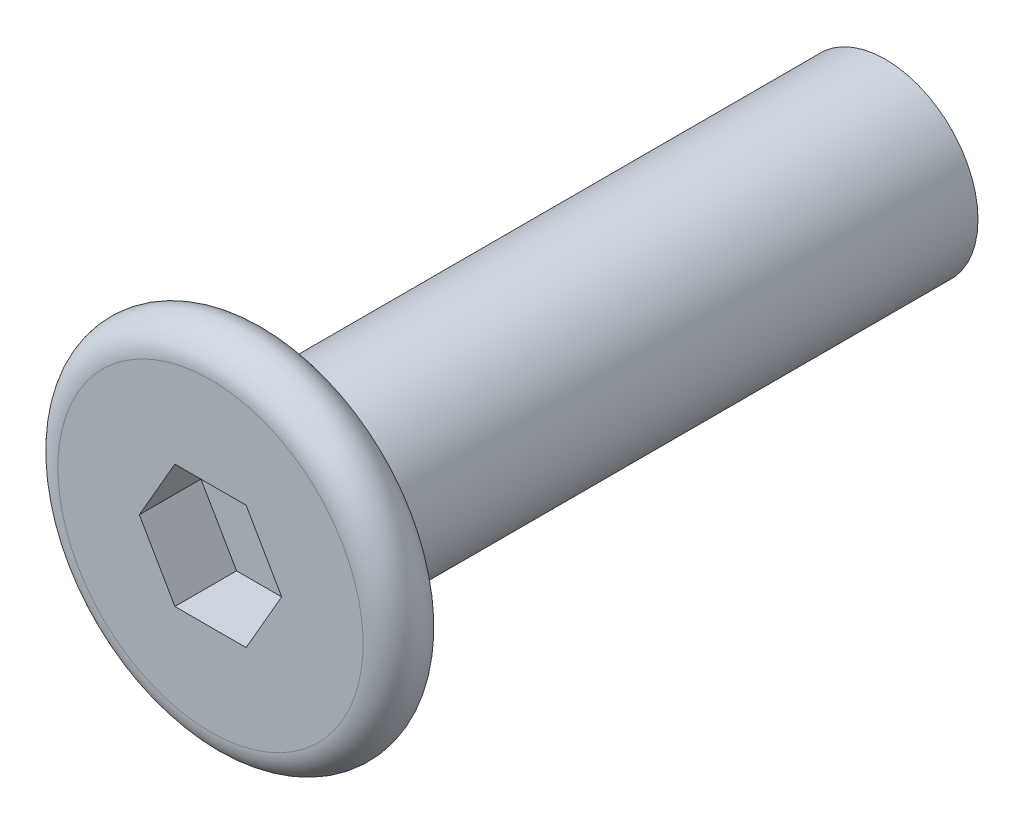
ISO-10303-21;
HEADER;
FILE_DESCRIPTION(('STEP AP214'),'2;1');
FILE_NAME('part.step','',(''),(''),'','','');
FILE_SCHEMA(('AUTOMOTIVE_DESIGN { 1 0 10303 214 1 1 1 1 }'));
ENDSEC;
DATA;
#1=APPLICATION_CONTEXT('core data for automotive mechanical design processes');
#2=APPLICATION_PROTOCOL_DEFINITION('international standard','automotive_design',2000,#1);
#3=PRODUCT_CONTEXT('',#1,'mechanical');
#4=PRODUCT('Part','Part','',(#3));
#5=PRODUCT_RELATED_PRODUCT_CATEGORY('part','',(#4));
#6=PRODUCT_DEFINITION_FORMATION('','',#4);
#7=PRODUCT_DEFINITION_CONTEXT('part definition',#1,'design');
#8=PRODUCT_DEFINITION('design','',#6,#7);
#9=PRODUCT_DEFINITION_SHAPE('','',#8);
#10=(LENGTH_UNIT() NAMED_UNIT(*) SI_UNIT(.MILLI.,.METRE.));
#11=(NAMED_UNIT(*) PLANE_ANGLE_UNIT() SI_UNIT($,.RADIAN.));
#12=(NAMED_UNIT(*) SI_UNIT($,.STERADIAN.) SOLID_ANGLE_UNIT());
#13=UNCERTAINTY_MEASURE_WITH_UNIT(LENGTH_MEASURE(1.E-05),#10,'distance_accuracy_value','');
#14=(GEOMETRIC_REPRESENTATION_CONTEXT(3) GLOBAL_UNCERTAINTY_ASSIGNED_CONTEXT((#13)) GLOBAL_UNIT_ASSIGNED_CONTEXT((#10,
#11,#12)) REPRESENTATION_CONTEXT('',''));
#15=CARTESIAN_POINT('',(0.,0.,0.));
#16=DIRECTION('',(0.,0.,1.));
#17=DIRECTION('',(1.,0.,0.));
#18=AXIS2_PLACEMENT_3D('',#15,#16,#17);
#19=CARTESIAN_POINT('',(0.,0.,-0.475));
#20=DIRECTION('',(0.,0.,-1.));
#21=DIRECTION('',(0.,1.,0.));
#22=AXIS2_PLACEMENT_3D('',#19,#20,#21);
#23=TOROIDAL_SURFACE('',#22,2.475,0.475);
#24=CARTESIAN_POINT('',(0.,0.,0.));
#25=DIRECTION('',(0.,0.,1.));
#26=DIRECTION('',(0.,-1.,0.));
#27=AXIS2_PLACEMENT_3D('',#24,#25,#26);
#28=CIRCLE('',#27,2.475);
#29=CARTESIAN_POINT('',(0.,-2.475,0.));
#30=VERTEX_POINT('',#29);
#31=EDGE_CURVE('E49',#30,#30,#28,.T.);
#32=ORIENTED_EDGE('',*,*,#31,.F.);
#33=EDGE_LOOP('',(#32));
#34=FACE_BOUND('',#33,.T.);
#35=CARTESIAN_POINT('',(0.,0.,-0.95));
#36=DIRECTION('',(0.,0.,-1.));
#37=DIRECTION('',(0.,1.,0.));
#38=AXIS2_PLACEMENT_3D('',#35,#36,#37);
#39=CIRCLE('',#38,2.475);
#40=CARTESIAN_POINT('',(0.,2.475,-0.95));
#41=VERTEX_POINT('',#40);
#42=EDGE_CURVE('E11',#41,#41,#39,.T.);
#43=ORIENTED_EDGE('',*,*,#42,.F.);
#44=EDGE_LOOP('',(#43));
#45=FACE_BOUND('',#44,.T.);
#46=ADVANCED_FACE('F41',(#34,#45),#23,.T.);
#47=CARTESIAN_POINT('',(0.,0.,0.));
#48=DIRECTION('',(0.,0.,1.));
#49=DIRECTION('',(0.,-1.,0.));
#50=AXIS2_PLACEMENT_3D('',#47,#48,#49);
#51=PLANE('',#50);
#52=DIRECTION('',(-0.5,0.866025403784439,0.));
#53=VECTOR('',#52,1.);
#54=CARTESIAN_POINT('',(1.15470053837925,0.,0.));
#55=LINE('',#54,#53);
#56=CARTESIAN_POINT('',(1.15470053837925,0.,0.));
#57=VERTEX_POINT('',#56);
#58=CARTESIAN_POINT('',(0.577350269189626,1.,0.));
#59=VERTEX_POINT('',#58);
#60=EDGE_CURVE('E56',#57,#59,#55,.T.);
#61=ORIENTED_EDGE('',*,*,#60,.F.);
#62=DIRECTION('',(0.5,0.866025403784439,0.));
#63=VECTOR('',#62,1.);
#64=CARTESIAN_POINT('',(0.577350269189626,-1.,0.));
#65=LINE('',#64,#63);
#66=CARTESIAN_POINT('',(0.577350269189626,-1.,0.));
#67=VERTEX_POINT('',#66);
#68=EDGE_CURVE('E139',#67,#57,#65,.T.);
#69=ORIENTED_EDGE('',*,*,#68,.F.);
#70=DIRECTION('',(1.,0.,0.));
#71=VECTOR('',#70,1.);
#72=CARTESIAN_POINT('',(-0.577350269189626,-1.,0.));
#73=LINE('',#72,#71);
#74=CARTESIAN_POINT('',(-0.577350269189626,-1.,0.));
#75=VERTEX_POINT('',#74);
#76=EDGE_CURVE('E137',#75,#67,#73,.T.);
#77=ORIENTED_EDGE('',*,*,#76,.F.);
#78=DIRECTION('',(0.5,-0.866025403784439,0.));
#79=VECTOR('',#78,1.);
#80=CARTESIAN_POINT('',(-1.15470053837925,0.,0.));
#81=LINE('',#80,#79);
#82=CARTESIAN_POINT('',(-1.15470053837925,0.,0.));
#83=VERTEX_POINT('',#82);
#84=EDGE_CURVE('E104',#83,#75,#81,.T.);
#85=ORIENTED_EDGE('',*,*,#84,.F.);
#86=DIRECTION('',(-0.5,-0.866025403784439,0.));
#87=VECTOR('',#86,1.);
#88=CARTESIAN_POINT('',(-0.577350269189626,1.,0.));
#89=LINE('',#88,#87);
#90=CARTESIAN_POINT('',(-0.577350269189626,1.,0.));
#91=VERTEX_POINT('',#90);
#92=EDGE_CURVE('E133',#91,#83,#89,.T.);
#93=ORIENTED_EDGE('',*,*,#92,.F.);
#94=DIRECTION('',(-1.,0.,0.));
#95=VECTOR('',#94,1.);
#96=CARTESIAN_POINT('',(0.577350269189626,1.,0.));
#97=LINE('',#96,#95);
#98=EDGE_CURVE('E130',#59,#91,#97,.T.);
#99=ORIENTED_EDGE('',*,*,#98,.F.);
#100=EDGE_LOOP('',(#61,#69,#77,#85,#93,#99));
#101=FACE_BOUND('',#100,.T.);
#102=ORIENTED_EDGE('',*,*,#31,.T.);
#103=EDGE_LOOP('',(#102));
#104=FACE_BOUND('',#103,.T.);
#105=ADVANCED_FACE('F156',(#101,#104),#51,.T.);
#106=CARTESIAN_POINT('',(0.,2.95,-0.95));
#107=DIRECTION('',(0.,0.,-1.));
#108=DIRECTION('',(0.,1.,0.));
#109=AXIS2_PLACEMENT_3D('',#106,#107,#108);
#110=PLANE('',#109);
#111=ORIENTED_EDGE('',*,*,#42,.T.);
#112=EDGE_LOOP('',(#111));
#113=FACE_BOUND('',#112,.T.);
#114=CARTESIAN_POINT('',(0.,0.,-0.950000000000001));
#115=DIRECTION('',(0.,0.,-1.));
#116=DIRECTION('',(0.,1.,0.));
#117=AXIS2_PLACEMENT_3D('',#114,#115,#116);
#118=CIRCLE('',#117,1.5);
#119=CARTESIAN_POINT('',(0.,1.5,-0.950000000000001));
#120=VERTEX_POINT('',#119);
#121=EDGE_CURVE('E151',#120,#120,#118,.T.);
#122=ORIENTED_EDGE('',*,*,#121,.F.);
#123=EDGE_LOOP('',(#122));
#124=FACE_BOUND('',#123,.T.);
#125=ADVANCED_FACE('F162',(#113,#124),#110,.T.);
#126=CARTESIAN_POINT('',(0.,0.,-10.95));
#127=DIRECTION('',(0.,0.,-1.));
#128=DIRECTION('',(0.,1.,0.));
#129=AXIS2_PLACEMENT_3D('',#126,#127,#128);
#130=CYLINDRICAL_SURFACE('',#129,1.5);
#131=ORIENTED_EDGE('',*,*,#121,.T.);
#132=EDGE_LOOP('',(#131));
#133=FACE_BOUND('',#132,.T.);
#134=CARTESIAN_POINT('',(0.,0.,-10.95));
#135=DIRECTION('',(0.,0.,-1.));
#136=DIRECTION('',(0.,1.,0.));
#137=AXIS2_PLACEMENT_3D('',#134,#135,#136);
#138=CIRCLE('',#137,1.5);
#139=CARTESIAN_POINT('',(0.,1.5,-10.95));
#140=VERTEX_POINT('',#139);
#141=EDGE_CURVE('E143',#140,#140,#138,.T.);
#142=ORIENTED_EDGE('',*,*,#141,.F.);
#143=EDGE_LOOP('',(#142));
#144=FACE_BOUND('',#143,.T.);
#145=ADVANCED_FACE('F165',(#133,#144),#130,.T.);
#146=CARTESIAN_POINT('',(0.,1.5,-10.95));
#147=DIRECTION('',(0.,0.,-1.));
#148=DIRECTION('',(0.,1.,0.));
#149=AXIS2_PLACEMENT_3D('',#146,#147,#148);
#150=PLANE('',#149);
#151=ORIENTED_EDGE('',*,*,#141,.T.);
#152=EDGE_LOOP('',(#151));
#153=FACE_BOUND('',#152,.T.);
#154=ADVANCED_FACE('F171',(#153),#150,.T.);
#155=CARTESIAN_POINT('',(1.15470053837925,0.,-1.));
#156=DIRECTION('',(0.866025403784439,0.5,0.));
#157=DIRECTION('',(-0.5,0.866025403784439,0.));
#158=AXIS2_PLACEMENT_3D('',#155,#156,#157);
#159=PLANE('',#158);
#160=ORIENTED_EDGE('',*,*,#60,.T.);
#161=DIRECTION('',(0.,0.,1.));
#162=VECTOR('',#161,1.);
#163=CARTESIAN_POINT('',(0.577350269189626,1.,-1.));
#164=LINE('',#163,#162);
#165=CARTESIAN_POINT('',(0.577350269189626,1.,-1.));
#166=VERTEX_POINT('',#165);
#167=EDGE_CURVE('E86',#166,#59,#164,.T.);
#168=ORIENTED_EDGE('',*,*,#167,.F.);
#169=DIRECTION('',(-0.5,0.866025403784439,0.));
#170=VECTOR('',#169,1.);
#171=CARTESIAN_POINT('',(1.15470053837925,0.,-1.));
#172=LINE('',#171,#170);
#173=CARTESIAN_POINT('',(1.15470053837925,0.,-1.));
#174=VERTEX_POINT('',#173);
#175=EDGE_CURVE('E141',#174,#166,#172,.T.);
#176=ORIENTED_EDGE('',*,*,#175,.F.);
#177=DIRECTION('',(0.,0.,1.));
#178=VECTOR('',#177,1.);
#179=CARTESIAN_POINT('',(1.15470053837925,0.,-1.));
#180=LINE('',#179,#178);
#181=EDGE_CURVE('E64',#174,#57,#180,.T.);
#182=ORIENTED_EDGE('',*,*,#181,.T.);
#183=EDGE_LOOP('',(#160,#168,#176,#182));
#184=FACE_BOUND('',#183,.T.);
#185=ADVANCED_FACE('F176',(#184),#159,.F.);
#186=CARTESIAN_POINT('',(0.577350269189626,-1.,-1.));
#187=DIRECTION('',(0.866025403784439,-0.5,0.));
#188=DIRECTION('',(0.5,0.866025403784439,0.));
#189=AXIS2_PLACEMENT_3D('',#186,#187,#188);
#190=PLANE('',#189);
#191=ORIENTED_EDGE('',*,*,#68,.T.);
#192=ORIENTED_EDGE('',*,*,#181,.F.);
#193=DIRECTION('',(0.5,0.866025403784439,0.));
#194=VECTOR('',#193,1.);
#195=CARTESIAN_POINT('',(0.577350269189626,-1.,-1.));
#196=LINE('',#195,#194);
#197=CARTESIAN_POINT('',(0.577350269189626,-1.,-1.));
#198=VERTEX_POINT('',#197);
#199=EDGE_CURVE('E116',#198,#174,#196,.T.);
#200=ORIENTED_EDGE('',*,*,#199,.F.);
#201=DIRECTION('',(0.,0.,1.));
#202=VECTOR('',#201,1.);
#203=CARTESIAN_POINT('',(0.577350269189626,-1.,-1.));
#204=LINE('',#203,#202);
#205=EDGE_CURVE('E108',#198,#67,#204,.T.);
#206=ORIENTED_EDGE('',*,*,#205,.T.);
#207=EDGE_LOOP('',(#191,#192,#200,#206));
#208=FACE_BOUND('',#207,.T.);
#209=ADVANCED_FACE('F181',(#208),#190,.F.);
#210=CARTESIAN_POINT('',(-0.577350269189626,-1.,-1.));
#211=DIRECTION('',(0.,-1.,0.));
#212=DIRECTION('',(0.,0.,-1.));
#213=AXIS2_PLACEMENT_3D('',#210,#211,#212);
#214=PLANE('',#213);
#215=ORIENTED_EDGE('',*,*,#76,.T.);
#216=ORIENTED_EDGE('',*,*,#205,.F.);
#217=DIRECTION('',(1.,0.,0.));
#218=VECTOR('',#217,1.);
#219=CARTESIAN_POINT('',(-0.577350269189626,-1.,-1.));
#220=LINE('',#219,#218);
#221=CARTESIAN_POINT('',(-0.577350269189626,-1.,-1.));
#222=VERTEX_POINT('',#221);
#223=EDGE_CURVE('E112',#222,#198,#220,.T.);
#224=ORIENTED_EDGE('',*,*,#223,.F.);
#225=DIRECTION('',(0.,0.,1.));
#226=VECTOR('',#225,1.);
#227=CARTESIAN_POINT('',(-0.577350269189626,-1.,-1.));
#228=LINE('',#227,#226);
#229=EDGE_CURVE('E97',#222,#75,#228,.T.);
#230=ORIENTED_EDGE('',*,*,#229,.T.);
#231=EDGE_LOOP('',(#215,#216,#224,#230));
#232=FACE_BOUND('',#231,.T.);
#233=ADVANCED_FACE('F113',(#232),#214,.F.);
#234=CARTESIAN_POINT('',(-1.15470053837925,0.,-1.));
#235=DIRECTION('',(-0.866025403784439,-0.5,0.));
#236=DIRECTION('',(0.5,-0.866025403784439,0.));
#237=AXIS2_PLACEMENT_3D('',#234,#235,#236);
#238=PLANE('',#237);
#239=ORIENTED_EDGE('',*,*,#84,.T.);
#240=ORIENTED_EDGE('',*,*,#229,.F.);
#241=DIRECTION('',(0.5,-0.866025403784439,0.));
#242=VECTOR('',#241,1.);
#243=CARTESIAN_POINT('',(-1.15470053837925,0.,-1.));
#244=LINE('',#243,#242);
#245=CARTESIAN_POINT('',(-1.15470053837925,0.,-1.));
#246=VERTEX_POINT('',#245);
#247=EDGE_CURVE('E101',#246,#222,#244,.T.);
#248=ORIENTED_EDGE('',*,*,#247,.F.);
#249=DIRECTION('',(0.,0.,1.));
#250=VECTOR('',#249,1.);
#251=CARTESIAN_POINT('',(-1.15470053837925,0.,-1.));
#252=LINE('',#251,#250);
#253=EDGE_CURVE('E109',#246,#83,#252,.T.);
#254=ORIENTED_EDGE('',*,*,#253,.T.);
#255=EDGE_LOOP('',(#239,#240,#248,#254));
#256=FACE_BOUND('',#255,.T.);
#257=ADVANCED_FACE('F99',(#256),#238,.F.);
#258=CARTESIAN_POINT('',(-0.577350269189626,1.,-1.));
#259=DIRECTION('',(-0.866025403784439,0.5,0.));
#260=DIRECTION('',(-0.5,-0.866025403784439,0.));
#261=AXIS2_PLACEMENT_3D('',#258,#259,#260);
#262=PLANE('',#261);
#263=ORIENTED_EDGE('',*,*,#92,.T.);
#264=ORIENTED_EDGE('',*,*,#253,.F.);
#265=DIRECTION('',(-0.5,-0.866025403784439,0.));
#266=VECTOR('',#265,1.);
#267=CARTESIAN_POINT('',(-0.577350269189626,1.,-1.));
#268=LINE('',#267,#266);
#269=CARTESIAN_POINT('',(-0.577350269189626,1.,-1.));
#270=VERTEX_POINT('',#269);
#271=EDGE_CURVE('E122',#270,#246,#268,.T.);
#272=ORIENTED_EDGE('',*,*,#271,.F.);
#273=DIRECTION('',(0.,0.,1.));
#274=VECTOR('',#273,1.);
#275=CARTESIAN_POINT('',(-0.577350269189626,1.,-1.));
#276=LINE('',#275,#274);
#277=EDGE_CURVE('E146',#270,#91,#276,.T.);
#278=ORIENTED_EDGE('',*,*,#277,.T.);
#279=EDGE_LOOP('',(#263,#264,#272,#278));
#280=FACE_BOUND('',#279,.T.);
#281=ADVANCED_FACE('F204',(#280),#262,.F.);
#282=CARTESIAN_POINT('',(0.577350269189626,1.,-1.));
#283=DIRECTION('',(0.,1.,0.));
#284=DIRECTION('',(-1.,0.,0.));
#285=AXIS2_PLACEMENT_3D('',#282,#283,#284);
#286=PLANE('',#285);
#287=ORIENTED_EDGE('',*,*,#98,.T.);
#288=ORIENTED_EDGE('',*,*,#277,.F.);
#289=DIRECTION('',(-1.,0.,0.));
#290=VECTOR('',#289,1.);
#291=CARTESIAN_POINT('',(0.577350269189626,1.,-1.));
#292=LINE('',#291,#290);
#293=EDGE_CURVE('E124',#166,#270,#292,.T.);
#294=ORIENTED_EDGE('',*,*,#293,.F.);
#295=ORIENTED_EDGE('',*,*,#167,.T.);
#296=EDGE_LOOP('',(#287,#288,#294,#295));
#297=FACE_BOUND('',#296,.T.);
#298=ADVANCED_FACE('F192',(#297),#286,.F.);
#299=CARTESIAN_POINT('',(0.,0.,-1.));
#300=DIRECTION('',(0.,0.,1.));
#301=DIRECTION('',(1.,0.,0.));
#302=AXIS2_PLACEMENT_3D('',#299,#300,#301);
#303=PLANE('',#302);
#304=ORIENTED_EDGE('',*,*,#175,.T.);
#305=ORIENTED_EDGE('',*,*,#293,.T.);
#306=ORIENTED_EDGE('',*,*,#271,.T.);
#307=ORIENTED_EDGE('',*,*,#247,.T.);
#308=ORIENTED_EDGE('',*,*,#223,.T.);
#309=ORIENTED_EDGE('',*,*,#199,.T.);
#310=EDGE_LOOP('',(#304,#305,#306,#307,#308,#309));
#311=FACE_BOUND('',#310,.T.);
#312=ADVANCED_FACE('F119',(#311),#303,.T.);
#313=CLOSED_SHELL('',(#46,#105,#125,#145,#154,#185,#209,#233,#257,#281,#298,#312));
#314=MANIFOLD_SOLID_BREP('B2',#313);
#315=ADVANCED_BREP_SHAPE_REPRESENTATION('',(#18,#314),#14);
#316=SHAPE_DEFINITION_REPRESENTATION(#9,#315);
ENDSEC;
END-ISO-10303-21;
